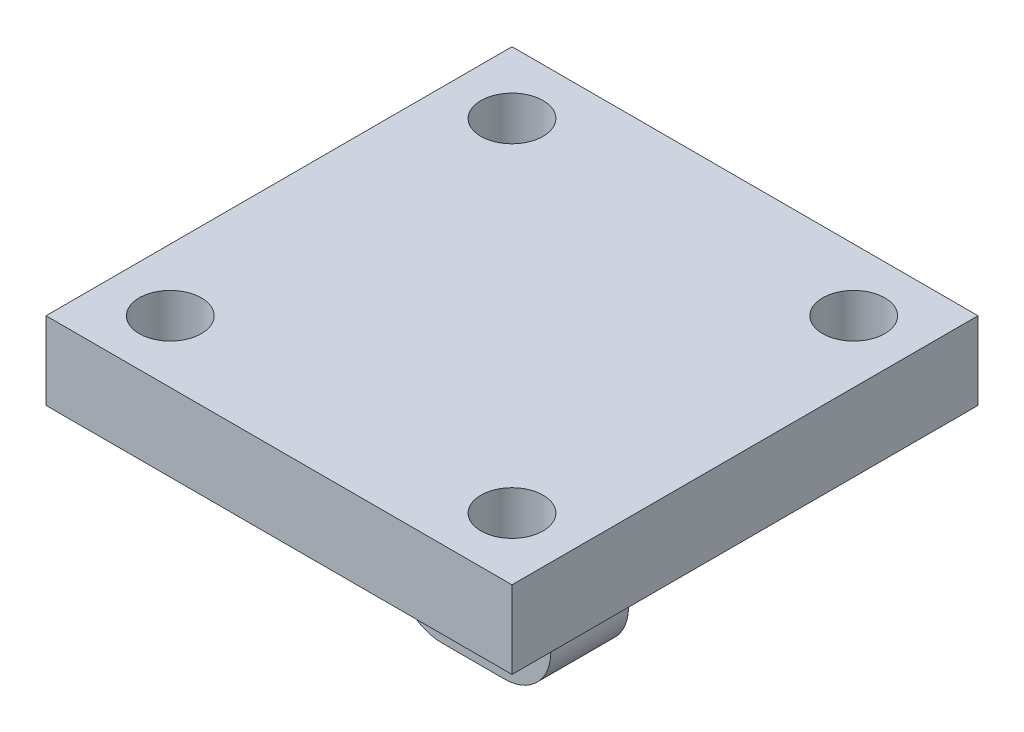
ISO-10303-21;
HEADER;
FILE_DESCRIPTION(('STEP AP214'),'2;1');
FILE_NAME('part.step','',(''),(''),'','','');
FILE_SCHEMA(('AUTOMOTIVE_DESIGN { 1 0 10303 214 1 1 1 1 }'));
ENDSEC;
DATA;
#1=APPLICATION_CONTEXT('core data for automotive mechanical design processes');
#2=APPLICATION_PROTOCOL_DEFINITION('international standard','automotive_design',2000,#1);
#3=PRODUCT_CONTEXT('',#1,'mechanical');
#4=PRODUCT('Part','Part','',(#3));
#5=PRODUCT_RELATED_PRODUCT_CATEGORY('part','',(#4));
#6=PRODUCT_DEFINITION_FORMATION('','',#4);
#7=PRODUCT_DEFINITION_CONTEXT('part definition',#1,'design');
#8=PRODUCT_DEFINITION('design','',#6,#7);
#9=PRODUCT_DEFINITION_SHAPE('','',#8);
#10=(LENGTH_UNIT() NAMED_UNIT(*) SI_UNIT(.MILLI.,.METRE.));
#11=(NAMED_UNIT(*) PLANE_ANGLE_UNIT() SI_UNIT($,.RADIAN.));
#12=(NAMED_UNIT(*) SI_UNIT($,.STERADIAN.) SOLID_ANGLE_UNIT());
#13=UNCERTAINTY_MEASURE_WITH_UNIT(LENGTH_MEASURE(1.E-05),#10,'distance_accuracy_value','');
#14=(GEOMETRIC_REPRESENTATION_CONTEXT(3) GLOBAL_UNCERTAINTY_ASSIGNED_CONTEXT((#13)) GLOBAL_UNIT_ASSIGNED_CONTEXT((#10,
#11,#12)) REPRESENTATION_CONTEXT('',''));
#15=CARTESIAN_POINT('',(0.,0.,0.));
#16=DIRECTION('',(0.,0.,1.));
#17=DIRECTION('',(1.,0.,0.));
#18=AXIS2_PLACEMENT_3D('',#15,#16,#17);
#19=CARTESIAN_POINT('',(-10.,0.,5.));
#20=DIRECTION('',(-1.,0.,0.));
#21=DIRECTION('',(0.,0.,1.));
#22=AXIS2_PLACEMENT_3D('',#19,#20,#21);
#23=PLANE('',#22);
#24=DIRECTION('',(0.,1.,0.));
#25=VECTOR('',#24,1.);
#26=CARTESIAN_POINT('',(-10.,0.,0.));
#27=LINE('',#26,#25);
#28=CARTESIAN_POINT('',(-10.,3.,0.));
#29=VERTEX_POINT('',#28);
#30=CARTESIAN_POINT('',(-10.,8.,0.));
#31=VERTEX_POINT('',#30);
#32=EDGE_CURVE('E208',#29,#31,#27,.T.);
#33=ORIENTED_EDGE('',*,*,#32,.F.);
#34=DIRECTION('',(0.,0.,-1.));
#35=VECTOR('',#34,1.);
#36=CARTESIAN_POINT('',(-10.,3.,5.));
#37=LINE('',#36,#35);
#38=CARTESIAN_POINT('',(-10.,3.,5.));
#39=VERTEX_POINT('',#38);
#40=EDGE_CURVE('E11',#29,#39,#37,.F.);
#41=ORIENTED_EDGE('',*,*,#40,.T.);
#42=DIRECTION('',(0.,1.,0.));
#43=VECTOR('',#42,1.);
#44=CARTESIAN_POINT('',(-10.,0.,5.));
#45=LINE('',#44,#43);
#46=CARTESIAN_POINT('',(-10.,8.,5.));
#47=VERTEX_POINT('',#46);
#48=EDGE_CURVE('E194',#39,#47,#45,.T.);
#49=ORIENTED_EDGE('',*,*,#48,.T.);
#50=DIRECTION('',(0.,0.,1.));
#51=VECTOR('',#50,1.);
#52=CARTESIAN_POINT('',(-10.,8.,0.));
#53=LINE('',#52,#51);
#54=EDGE_CURVE('E227',#47,#31,#53,.F.);
#55=ORIENTED_EDGE('',*,*,#54,.T.);
#56=EDGE_LOOP('',(#33,#41,#49,#55));
#57=FACE_BOUND('',#56,.T.);
#58=ADVANCED_FACE('F38',(#57),#23,.T.);
#59=CARTESIAN_POINT('',(0.,0.,5.));
#60=DIRECTION('',(0.,-1.,0.));
#61=DIRECTION('',(1.,0.,0.));
#62=AXIS2_PLACEMENT_3D('',#59,#60,#61);
#63=PLANE('',#62);
#64=DIRECTION('',(-1.,0.,0.));
#65=VECTOR('',#64,1.);
#66=CARTESIAN_POINT('',(0.,0.,0.));
#67=LINE('',#66,#65);
#68=CARTESIAN_POINT('',(-3.,0.,0.));
#69=VERTEX_POINT('',#68);
#70=CARTESIAN_POINT('',(-7.,0.,0.));
#71=VERTEX_POINT('',#70);
#72=EDGE_CURVE('E211',#69,#71,#67,.T.);
#73=ORIENTED_EDGE('',*,*,#72,.F.);
#74=DIRECTION('',(0.,0.,-1.));
#75=VECTOR('',#74,1.);
#76=CARTESIAN_POINT('',(-3.,0.,5.));
#77=LINE('',#76,#75);
#78=CARTESIAN_POINT('',(-3.,0.,5.));
#79=VERTEX_POINT('',#78);
#80=EDGE_CURVE('E265',#69,#79,#77,.F.);
#81=ORIENTED_EDGE('',*,*,#80,.T.);
#82=DIRECTION('',(-1.,0.,0.));
#83=VECTOR('',#82,1.);
#84=CARTESIAN_POINT('',(0.,0.,5.));
#85=LINE('',#84,#83);
#86=CARTESIAN_POINT('',(-7.,0.,5.));
#87=VERTEX_POINT('',#86);
#88=EDGE_CURVE('E198',#79,#87,#85,.T.);
#89=ORIENTED_EDGE('',*,*,#88,.T.);
#90=DIRECTION('',(0.,0.,-1.));
#91=VECTOR('',#90,1.);
#92=CARTESIAN_POINT('',(-7.,0.,5.));
#93=LINE('',#92,#91);
#94=EDGE_CURVE('E261',#87,#71,#93,.T.);
#95=ORIENTED_EDGE('',*,*,#94,.T.);
#96=EDGE_LOOP('',(#73,#81,#89,#95));
#97=FACE_BOUND('',#96,.T.);
#98=ADVANCED_FACE('F287',(#97),#63,.T.);
#99=CARTESIAN_POINT('',(0.,0.,5.));
#100=DIRECTION('',(-1.,0.,0.));
#101=DIRECTION('',(0.,0.,1.));
#102=AXIS2_PLACEMENT_3D('',#99,#100,#101);
#103=PLANE('',#102);
#104=DIRECTION('',(0.,1.,0.));
#105=VECTOR('',#104,1.);
#106=CARTESIAN_POINT('',(0.,0.,5.));
#107=LINE('',#106,#105);
#108=CARTESIAN_POINT('',(0.,3.,5.));
#109=VERTEX_POINT('',#108);
#110=CARTESIAN_POINT('',(0.,8.,5.));
#111=VERTEX_POINT('',#110);
#112=EDGE_CURVE('E201',#109,#111,#107,.T.);
#113=ORIENTED_EDGE('',*,*,#112,.F.);
#114=DIRECTION('',(0.,0.,-1.));
#115=VECTOR('',#114,1.);
#116=CARTESIAN_POINT('',(0.,3.,0.));
#117=LINE('',#116,#115);
#118=CARTESIAN_POINT('',(0.,3.,0.));
#119=VERTEX_POINT('',#118);
#120=EDGE_CURVE('E251',#109,#119,#117,.T.);
#121=ORIENTED_EDGE('',*,*,#120,.T.);
#122=DIRECTION('',(0.,1.,0.));
#123=VECTOR('',#122,1.);
#124=CARTESIAN_POINT('',(0.,0.,0.));
#125=LINE('',#124,#123);
#126=CARTESIAN_POINT('',(0.,8.,0.));
#127=VERTEX_POINT('',#126);
#128=EDGE_CURVE('E195',#119,#127,#125,.T.);
#129=ORIENTED_EDGE('',*,*,#128,.T.);
#130=DIRECTION('',(0.,0.,1.));
#131=VECTOR('',#130,1.);
#132=CARTESIAN_POINT('',(0.,8.,5.));
#133=LINE('',#132,#131);
#134=EDGE_CURVE('E231',#127,#111,#133,.T.);
#135=ORIENTED_EDGE('',*,*,#134,.T.);
#136=EDGE_LOOP('',(#113,#121,#129,#135));
#137=FACE_BOUND('',#136,.T.);
#138=ADVANCED_FACE('F279',(#137),#103,.F.);
#139=CARTESIAN_POINT('',(-5.,4.24,5.));
#140=DIRECTION('',(0.,0.,-1.));
#141=DIRECTION('',(-1.,0.,0.));
#142=AXIS2_PLACEMENT_3D('',#139,#140,#141);
#143=CYLINDRICAL_SURFACE('',#142,2.);
#144=CARTESIAN_POINT('',(-5.,4.24,5.));
#145=DIRECTION('',(0.,0.,1.));
#146=DIRECTION('',(1.,0.,0.));
#147=AXIS2_PLACEMENT_3D('',#144,#145,#146);
#148=CIRCLE('',#147,2.);
#149=CARTESIAN_POINT('',(-3.,4.24,5.));
#150=VERTEX_POINT('',#149);
#151=EDGE_CURVE('E190',#150,#150,#148,.T.);
#152=ORIENTED_EDGE('',*,*,#151,.T.);
#153=EDGE_LOOP('',(#152));
#154=FACE_BOUND('',#153,.T.);
#155=CARTESIAN_POINT('',(-5.,4.24,0.));
#156=DIRECTION('',(0.,0.,1.));
#157=DIRECTION('',(1.,0.,0.));
#158=AXIS2_PLACEMENT_3D('',#155,#156,#157);
#159=CIRCLE('',#158,2.);
#160=CARTESIAN_POINT('',(-3.,4.24,0.));
#161=VERTEX_POINT('',#160);
#162=EDGE_CURVE('E189',#161,#161,#159,.T.);
#163=ORIENTED_EDGE('',*,*,#162,.F.);
#164=EDGE_LOOP('',(#163));
#165=FACE_BOUND('',#164,.T.);
#166=ADVANCED_FACE('F317',(#154,#165),#143,.F.);
#167=CARTESIAN_POINT('',(0.,0.,5.));
#168=DIRECTION('',(0.,0.,1.));
#169=DIRECTION('',(1.,0.,0.));
#170=AXIS2_PLACEMENT_3D('',#167,#168,#169);
#171=PLANE('',#170);
#172=ORIENTED_EDGE('',*,*,#88,.F.);
#173=CARTESIAN_POINT('',(-3.,3.,5.));
#174=DIRECTION('',(0.,0.,1.));
#175=DIRECTION('',(1.,0.,0.));
#176=AXIS2_PLACEMENT_3D('',#173,#174,#175);
#177=CIRCLE('',#176,3.);
#178=EDGE_CURVE('E47',#79,#109,#177,.T.);
#179=ORIENTED_EDGE('',*,*,#178,.T.);
#180=ORIENTED_EDGE('',*,*,#112,.T.);
#181=CARTESIAN_POINT('',(5.,8.,5.));
#182=DIRECTION('',(0.,0.,1.));
#183=DIRECTION('',(1.,0.,0.));
#184=AXIS2_PLACEMENT_3D('',#181,#182,#183);
#185=CIRCLE('',#184,5.);
#186=CARTESIAN_POINT('',(5.,13.,5.));
#187=VERTEX_POINT('',#186);
#188=EDGE_CURVE('E243',#111,#187,#185,.F.);
#189=ORIENTED_EDGE('',*,*,#188,.T.);
#190=DIRECTION('',(1.,0.,0.));
#191=VECTOR('',#190,1.);
#192=CARTESIAN_POINT('',(0.,13.,5.));
#193=LINE('',#192,#191);
#194=CARTESIAN_POINT('',(-15.,13.,5.));
#195=VERTEX_POINT('',#194);
#196=EDGE_CURVE('E181',#195,#187,#193,.T.);
#197=ORIENTED_EDGE('',*,*,#196,.F.);
#198=CARTESIAN_POINT('',(-15.,8.,5.));
#199=DIRECTION('',(0.,0.,1.));
#200=DIRECTION('',(1.,0.,0.));
#201=AXIS2_PLACEMENT_3D('',#198,#199,#200);
#202=CIRCLE('',#201,5.);
#203=EDGE_CURVE('E235',#195,#47,#202,.F.);
#204=ORIENTED_EDGE('',*,*,#203,.T.);
#205=ORIENTED_EDGE('',*,*,#48,.F.);
#206=CARTESIAN_POINT('',(-7.,3.,5.));
#207=DIRECTION('',(0.,0.,1.));
#208=DIRECTION('',(1.,0.,0.));
#209=AXIS2_PLACEMENT_3D('',#206,#207,#208);
#210=CIRCLE('',#209,3.);
#211=EDGE_CURVE('E59',#39,#87,#210,.T.);
#212=ORIENTED_EDGE('',*,*,#211,.T.);
#213=EDGE_LOOP('',(#172,#179,#180,#189,#197,#204,#205,#212));
#214=FACE_BOUND('',#213,.T.);
#215=ORIENTED_EDGE('',*,*,#151,.F.);
#216=EDGE_LOOP('',(#215));
#217=FACE_BOUND('',#216,.T.);
#218=ADVANCED_FACE('F272',(#214,#217),#171,.T.);
#219=CARTESIAN_POINT('',(0.,0.,0.));
#220=DIRECTION('',(0.,0.,1.));
#221=DIRECTION('',(1.,0.,0.));
#222=AXIS2_PLACEMENT_3D('',#219,#220,#221);
#223=PLANE('',#222);
#224=ORIENTED_EDGE('',*,*,#162,.T.);
#225=EDGE_LOOP('',(#224));
#226=FACE_BOUND('',#225,.T.);
#227=ORIENTED_EDGE('',*,*,#128,.F.);
#228=CARTESIAN_POINT('',(-3.,3.,0.));
#229=DIRECTION('',(0.,0.,1.));
#230=DIRECTION('',(1.,0.,0.));
#231=AXIS2_PLACEMENT_3D('',#228,#229,#230);
#232=CIRCLE('',#231,3.);
#233=EDGE_CURVE('E258',#119,#69,#232,.F.);
#234=ORIENTED_EDGE('',*,*,#233,.T.);
#235=ORIENTED_EDGE('',*,*,#72,.T.);
#236=CARTESIAN_POINT('',(-7.,3.,0.));
#237=DIRECTION('',(0.,0.,1.));
#238=DIRECTION('',(1.,0.,0.));
#239=AXIS2_PLACEMENT_3D('',#236,#237,#238);
#240=CIRCLE('',#239,3.);
#241=EDGE_CURVE('E255',#71,#29,#240,.F.);
#242=ORIENTED_EDGE('',*,*,#241,.T.);
#243=ORIENTED_EDGE('',*,*,#32,.T.);
#244=CARTESIAN_POINT('',(-15.,8.,0.));
#245=DIRECTION('',(0.,0.,1.));
#246=DIRECTION('',(1.,0.,0.));
#247=AXIS2_PLACEMENT_3D('',#244,#245,#246);
#248=CIRCLE('',#247,5.);
#249=CARTESIAN_POINT('',(-15.,13.,0.));
#250=VERTEX_POINT('',#249);
#251=EDGE_CURVE('E239',#31,#250,#248,.T.);
#252=ORIENTED_EDGE('',*,*,#251,.T.);
#253=DIRECTION('',(1.,0.,0.));
#254=VECTOR('',#253,1.);
#255=CARTESIAN_POINT('',(0.,13.,0.));
#256=LINE('',#255,#254);
#257=CARTESIAN_POINT('',(5.,13.,0.));
#258=VERTEX_POINT('',#257);
#259=EDGE_CURVE('E204',#250,#258,#256,.T.);
#260=ORIENTED_EDGE('',*,*,#259,.T.);
#261=CARTESIAN_POINT('',(5.,8.,0.));
#262=DIRECTION('',(0.,0.,1.));
#263=DIRECTION('',(1.,0.,0.));
#264=AXIS2_PLACEMENT_3D('',#261,#262,#263);
#265=CIRCLE('',#264,5.);
#266=EDGE_CURVE('E247',#258,#127,#265,.T.);
#267=ORIENTED_EDGE('',*,*,#266,.T.);
#268=EDGE_LOOP('',(#227,#234,#235,#242,#243,#252,#260,#267));
#269=FACE_BOUND('',#268,.T.);
#270=ADVANCED_FACE('F285',(#226,#269),#223,.F.);
#271=CARTESIAN_POINT('',(-20.,13.,17.5));
#272=DIRECTION('',(-1.,0.,0.));
#273=DIRECTION('',(0.,0.,1.));
#274=AXIS2_PLACEMENT_3D('',#271,#272,#273);
#275=PLANE('',#274);
#276=DIRECTION('',(0.,0.,1.));
#277=VECTOR('',#276,1.);
#278=CARTESIAN_POINT('',(-20.,18.,17.5));
#279=LINE('',#278,#277);
#280=CARTESIAN_POINT('',(-20.,18.,-12.5));
#281=VERTEX_POINT('',#280);
#282=CARTESIAN_POINT('',(-20.,18.,17.5));
#283=VERTEX_POINT('',#282);
#284=EDGE_CURVE('E170',#281,#283,#279,.T.);
#285=ORIENTED_EDGE('',*,*,#284,.F.);
#286=DIRECTION('',(0.,1.,0.));
#287=VECTOR('',#286,1.);
#288=CARTESIAN_POINT('',(-20.,13.,-12.5));
#289=LINE('',#288,#287);
#290=CARTESIAN_POINT('',(-20.,13.,-12.5));
#291=VERTEX_POINT('',#290);
#292=EDGE_CURVE('E154',#291,#281,#289,.T.);
#293=ORIENTED_EDGE('',*,*,#292,.F.);
#294=DIRECTION('',(0.,0.,1.));
#295=VECTOR('',#294,1.);
#296=CARTESIAN_POINT('',(-20.,13.,17.5));
#297=LINE('',#296,#295);
#298=CARTESIAN_POINT('',(-20.,13.,17.5));
#299=VERTEX_POINT('',#298);
#300=EDGE_CURVE('E147',#291,#299,#297,.T.);
#301=ORIENTED_EDGE('',*,*,#300,.T.);
#302=DIRECTION('',(0.,1.,0.));
#303=VECTOR('',#302,1.);
#304=CARTESIAN_POINT('',(-20.,13.,17.5));
#305=LINE('',#304,#303);
#306=EDGE_CURVE('E128',#299,#283,#305,.T.);
#307=ORIENTED_EDGE('',*,*,#306,.T.);
#308=EDGE_LOOP('',(#285,#293,#301,#307));
#309=FACE_BOUND('',#308,.T.);
#310=ADVANCED_FACE('F153',(#309),#275,.T.);
#311=CARTESIAN_POINT('',(-20.,13.,-12.5));
#312=DIRECTION('',(0.,0.,-1.));
#313=DIRECTION('',(-1.,0.,0.));
#314=AXIS2_PLACEMENT_3D('',#311,#312,#313);
#315=PLANE('',#314);
#316=DIRECTION('',(-1.,0.,0.));
#317=VECTOR('',#316,1.);
#318=CARTESIAN_POINT('',(-20.,18.,-12.5));
#319=LINE('',#318,#317);
#320=CARTESIAN_POINT('',(10.,18.,-12.5));
#321=VERTEX_POINT('',#320);
#322=EDGE_CURVE('E156',#321,#281,#319,.T.);
#323=ORIENTED_EDGE('',*,*,#322,.F.);
#324=DIRECTION('',(0.,1.,0.));
#325=VECTOR('',#324,1.);
#326=CARTESIAN_POINT('',(10.,13.,-12.5));
#327=LINE('',#326,#325);
#328=CARTESIAN_POINT('',(10.,13.,-12.5));
#329=VERTEX_POINT('',#328);
#330=EDGE_CURVE('E182',#329,#321,#327,.T.);
#331=ORIENTED_EDGE('',*,*,#330,.F.);
#332=DIRECTION('',(-1.,0.,0.));
#333=VECTOR('',#332,1.);
#334=CARTESIAN_POINT('',(-20.,13.,-12.5));
#335=LINE('',#334,#333);
#336=EDGE_CURVE('E140',#329,#291,#335,.T.);
#337=ORIENTED_EDGE('',*,*,#336,.T.);
#338=ORIENTED_EDGE('',*,*,#292,.T.);
#339=EDGE_LOOP('',(#323,#331,#337,#338));
#340=FACE_BOUND('',#339,.T.);
#341=ADVANCED_FACE('F334',(#340),#315,.T.);
#342=CARTESIAN_POINT('',(10.,13.,17.5));
#343=DIRECTION('',(1.,0.,0.));
#344=DIRECTION('',(0.,0.,-1.));
#345=AXIS2_PLACEMENT_3D('',#342,#343,#344);
#346=PLANE('',#345);
#347=DIRECTION('',(0.,0.,-1.));
#348=VECTOR('',#347,1.);
#349=CARTESIAN_POINT('',(10.,18.,17.5));
#350=LINE('',#349,#348);
#351=CARTESIAN_POINT('',(10.,18.,17.5));
#352=VERTEX_POINT('',#351);
#353=EDGE_CURVE('E160',#352,#321,#350,.T.);
#354=ORIENTED_EDGE('',*,*,#353,.F.);
#355=DIRECTION('',(0.,1.,0.));
#356=VECTOR('',#355,1.);
#357=CARTESIAN_POINT('',(10.,13.,17.5));
#358=LINE('',#357,#356);
#359=CARTESIAN_POINT('',(10.,13.,17.5));
#360=VERTEX_POINT('',#359);
#361=EDGE_CURVE('E139',#360,#352,#358,.T.);
#362=ORIENTED_EDGE('',*,*,#361,.F.);
#363=DIRECTION('',(0.,0.,-1.));
#364=VECTOR('',#363,1.);
#365=CARTESIAN_POINT('',(10.,13.,17.5));
#366=LINE('',#365,#364);
#367=EDGE_CURVE('E150',#360,#329,#366,.T.);
#368=ORIENTED_EDGE('',*,*,#367,.T.);
#369=ORIENTED_EDGE('',*,*,#330,.T.);
#370=EDGE_LOOP('',(#354,#362,#368,#369));
#371=FACE_BOUND('',#370,.T.);
#372=ADVANCED_FACE('F364',(#371),#346,.T.);
#373=CARTESIAN_POINT('',(-20.,13.,17.5));
#374=DIRECTION('',(0.,0.,1.));
#375=DIRECTION('',(1.,0.,0.));
#376=AXIS2_PLACEMENT_3D('',#373,#374,#375);
#377=PLANE('',#376);
#378=DIRECTION('',(1.,0.,0.));
#379=VECTOR('',#378,1.);
#380=CARTESIAN_POINT('',(-20.,18.,17.5));
#381=LINE('',#380,#379);
#382=EDGE_CURVE('E133',#283,#352,#381,.T.);
#383=ORIENTED_EDGE('',*,*,#382,.F.);
#384=ORIENTED_EDGE('',*,*,#306,.F.);
#385=DIRECTION('',(1.,0.,0.));
#386=VECTOR('',#385,1.);
#387=CARTESIAN_POINT('',(-20.,13.,17.5));
#388=LINE('',#387,#386);
#389=EDGE_CURVE('E131',#299,#360,#388,.T.);
#390=ORIENTED_EDGE('',*,*,#389,.T.);
#391=ORIENTED_EDGE('',*,*,#361,.T.);
#392=EDGE_LOOP('',(#383,#384,#390,#391));
#393=FACE_BOUND('',#392,.T.);
#394=ADVANCED_FACE('F130',(#393),#377,.T.);
#395=CARTESIAN_POINT('',(0.,13.,0.));
#396=DIRECTION('',(0.,-1.,0.));
#397=DIRECTION('',(0.,0.,-1.));
#398=AXIS2_PLACEMENT_3D('',#395,#396,#397);
#399=PLANE('',#398);
#400=CARTESIAN_POINT('',(-16.,13.,13.5));
#401=DIRECTION('',(0.,1.,0.));
#402=DIRECTION('',(0.,0.,1.));
#403=AXIS2_PLACEMENT_3D('',#400,#401,#402);
#404=CIRCLE('',#403,2.);
#405=CARTESIAN_POINT('',(-16.,13.,15.5));
#406=VERTEX_POINT('',#405);
#407=EDGE_CURVE('E406',#406,#406,#404,.T.);
#408=ORIENTED_EDGE('',*,*,#407,.T.);
#409=EDGE_LOOP('',(#408));
#410=FACE_BOUND('',#409,.T.);
#411=CARTESIAN_POINT('',(6.,13.,13.5));
#412=DIRECTION('',(0.,1.,0.));
#413=DIRECTION('',(0.,0.,1.));
#414=AXIS2_PLACEMENT_3D('',#411,#412,#413);
#415=CIRCLE('',#414,2.);
#416=CARTESIAN_POINT('',(6.,13.,15.5));
#417=VERTEX_POINT('',#416);
#418=EDGE_CURVE('E396',#417,#417,#415,.T.);
#419=ORIENTED_EDGE('',*,*,#418,.T.);
#420=EDGE_LOOP('',(#419));
#421=FACE_BOUND('',#420,.T.);
#422=CARTESIAN_POINT('',(6.,13.,-8.5));
#423=DIRECTION('',(0.,1.,0.));
#424=DIRECTION('',(0.,0.,1.));
#425=AXIS2_PLACEMENT_3D('',#422,#423,#424);
#426=CIRCLE('',#425,2.);
#427=CARTESIAN_POINT('',(6.,13.,-6.5));
#428=VERTEX_POINT('',#427);
#429=EDGE_CURVE('E394',#428,#428,#426,.T.);
#430=ORIENTED_EDGE('',*,*,#429,.T.);
#431=EDGE_LOOP('',(#430));
#432=FACE_BOUND('',#431,.T.);
#433=CARTESIAN_POINT('',(-16.,13.,-8.5));
#434=DIRECTION('',(0.,1.,0.));
#435=DIRECTION('',(0.,0.,1.));
#436=AXIS2_PLACEMENT_3D('',#433,#434,#435);
#437=CIRCLE('',#436,2.);
#438=CARTESIAN_POINT('',(-16.,13.,-6.5));
#439=VERTEX_POINT('',#438);
#440=EDGE_CURVE('E173',#439,#439,#437,.T.);
#441=ORIENTED_EDGE('',*,*,#440,.T.);
#442=EDGE_LOOP('',(#441));
#443=FACE_BOUND('',#442,.T.);
#444=DIRECTION('',(0.,0.,1.));
#445=VECTOR('',#444,1.);
#446=CARTESIAN_POINT('',(-15.,13.,5.));
#447=LINE('',#446,#445);
#448=EDGE_CURVE('E223',#250,#195,#447,.T.);
#449=ORIENTED_EDGE('',*,*,#448,.T.);
#450=ORIENTED_EDGE('',*,*,#196,.T.);
#451=DIRECTION('',(0.,0.,1.));
#452=VECTOR('',#451,1.);
#453=CARTESIAN_POINT('',(5.,13.,0.));
#454=LINE('',#453,#452);
#455=EDGE_CURVE('E219',#187,#258,#454,.F.);
#456=ORIENTED_EDGE('',*,*,#455,.T.);
#457=ORIENTED_EDGE('',*,*,#259,.F.);
#458=EDGE_LOOP('',(#449,#450,#456,#457));
#459=FACE_BOUND('',#458,.T.);
#460=ORIENTED_EDGE('',*,*,#300,.F.);
#461=ORIENTED_EDGE('',*,*,#336,.F.);
#462=ORIENTED_EDGE('',*,*,#367,.F.);
#463=ORIENTED_EDGE('',*,*,#389,.F.);
#464=EDGE_LOOP('',(#460,#461,#462,#463));
#465=FACE_BOUND('',#464,.T.);
#466=ADVANCED_FACE('F145',(#410,#421,#432,#443,#459,#465),#399,.T.);
#467=CARTESIAN_POINT('',(0.,18.,5.));
#468=DIRECTION('',(0.,-1.,0.));
#469=DIRECTION('',(0.,0.,-1.));
#470=AXIS2_PLACEMENT_3D('',#467,#468,#469);
#471=PLANE('',#470);
#472=CARTESIAN_POINT('',(-16.,18.,13.5));
#473=DIRECTION('',(0.,1.,0.));
#474=DIRECTION('',(0.,0.,1.));
#475=AXIS2_PLACEMENT_3D('',#472,#473,#474);
#476=CIRCLE('',#475,2.);
#477=CARTESIAN_POINT('',(-16.,18.,15.5));
#478=VERTEX_POINT('',#477);
#479=EDGE_CURVE('E348',#478,#478,#476,.T.);
#480=ORIENTED_EDGE('',*,*,#479,.F.);
#481=EDGE_LOOP('',(#480));
#482=FACE_BOUND('',#481,.T.);
#483=CARTESIAN_POINT('',(6.,18.,13.5));
#484=DIRECTION('',(0.,1.,0.));
#485=DIRECTION('',(0.,0.,1.));
#486=AXIS2_PLACEMENT_3D('',#483,#484,#485);
#487=CIRCLE('',#486,2.);
#488=CARTESIAN_POINT('',(6.,18.,15.5));
#489=VERTEX_POINT('',#488);
#490=EDGE_CURVE('E352',#489,#489,#487,.T.);
#491=ORIENTED_EDGE('',*,*,#490,.F.);
#492=EDGE_LOOP('',(#491));
#493=FACE_BOUND('',#492,.T.);
#494=CARTESIAN_POINT('',(6.,18.,-8.5));
#495=DIRECTION('',(0.,1.,0.));
#496=DIRECTION('',(0.,0.,1.));
#497=AXIS2_PLACEMENT_3D('',#494,#495,#496);
#498=CIRCLE('',#497,2.);
#499=CARTESIAN_POINT('',(6.,18.,-6.5));
#500=VERTEX_POINT('',#499);
#501=EDGE_CURVE('E356',#500,#500,#498,.T.);
#502=ORIENTED_EDGE('',*,*,#501,.F.);
#503=EDGE_LOOP('',(#502));
#504=FACE_BOUND('',#503,.T.);
#505=CARTESIAN_POINT('',(-16.,18.,-8.5));
#506=DIRECTION('',(0.,1.,0.));
#507=DIRECTION('',(0.,0.,1.));
#508=AXIS2_PLACEMENT_3D('',#505,#506,#507);
#509=CIRCLE('',#508,2.);
#510=CARTESIAN_POINT('',(-16.,18.,-6.5));
#511=VERTEX_POINT('',#510);
#512=EDGE_CURVE('E163',#511,#511,#509,.T.);
#513=ORIENTED_EDGE('',*,*,#512,.F.);
#514=EDGE_LOOP('',(#513));
#515=FACE_BOUND('',#514,.T.);
#516=ORIENTED_EDGE('',*,*,#284,.T.);
#517=ORIENTED_EDGE('',*,*,#382,.T.);
#518=ORIENTED_EDGE('',*,*,#353,.T.);
#519=ORIENTED_EDGE('',*,*,#322,.T.);
#520=EDGE_LOOP('',(#516,#517,#518,#519));
#521=FACE_BOUND('',#520,.T.);
#522=ADVANCED_FACE('F307',(#482,#493,#504,#515,#521),#471,.F.);
#523=CARTESIAN_POINT('',(-15.,8.,0.));
#524=DIRECTION('',(0.,0.,-1.));
#525=DIRECTION('',(-1.,0.,0.));
#526=AXIS2_PLACEMENT_3D('',#523,#524,#525);
#527=CYLINDRICAL_SURFACE('',#526,5.);
#528=ORIENTED_EDGE('',*,*,#251,.F.);
#529=ORIENTED_EDGE('',*,*,#54,.F.);
#530=ORIENTED_EDGE('',*,*,#203,.F.);
#531=ORIENTED_EDGE('',*,*,#448,.F.);
#532=EDGE_LOOP('',(#528,#529,#530,#531));
#533=FACE_BOUND('',#532,.T.);
#534=ADVANCED_FACE('F295',(#533),#527,.F.);
#535=CARTESIAN_POINT('',(5.,8.,5.));
#536=DIRECTION('',(0.,0.,1.));
#537=DIRECTION('',(1.,0.,0.));
#538=AXIS2_PLACEMENT_3D('',#535,#536,#537);
#539=CYLINDRICAL_SURFACE('',#538,5.);
#540=ORIENTED_EDGE('',*,*,#266,.F.);
#541=ORIENTED_EDGE('',*,*,#455,.F.);
#542=ORIENTED_EDGE('',*,*,#188,.F.);
#543=ORIENTED_EDGE('',*,*,#134,.F.);
#544=EDGE_LOOP('',(#540,#541,#542,#543));
#545=FACE_BOUND('',#544,.T.);
#546=ADVANCED_FACE('F300',(#545),#539,.F.);
#547=CARTESIAN_POINT('',(-3.,3.,5.));
#548=DIRECTION('',(0.,0.,1.));
#549=DIRECTION('',(1.,0.,0.));
#550=AXIS2_PLACEMENT_3D('',#547,#548,#549);
#551=CYLINDRICAL_SURFACE('',#550,3.);
#552=ORIENTED_EDGE('',*,*,#178,.F.);
#553=ORIENTED_EDGE('',*,*,#80,.F.);
#554=ORIENTED_EDGE('',*,*,#233,.F.);
#555=ORIENTED_EDGE('',*,*,#120,.F.);
#556=EDGE_LOOP('',(#552,#553,#554,#555));
#557=FACE_BOUND('',#556,.T.);
#558=ADVANCED_FACE('F282',(#557),#551,.T.);
#559=CARTESIAN_POINT('',(-7.,3.,5.));
#560=DIRECTION('',(0.,0.,-1.));
#561=DIRECTION('',(-1.,0.,0.));
#562=AXIS2_PLACEMENT_3D('',#559,#560,#561);
#563=CYLINDRICAL_SURFACE('',#562,3.);
#564=ORIENTED_EDGE('',*,*,#211,.F.);
#565=ORIENTED_EDGE('',*,*,#40,.F.);
#566=ORIENTED_EDGE('',*,*,#241,.F.);
#567=ORIENTED_EDGE('',*,*,#94,.F.);
#568=EDGE_LOOP('',(#564,#565,#566,#567));
#569=FACE_BOUND('',#568,.T.);
#570=ADVANCED_FACE('F40',(#569),#563,.T.);
#571=CARTESIAN_POINT('',(-16.,13.,-8.5));
#572=DIRECTION('',(0.,1.,0.));
#573=DIRECTION('',(0.,0.,1.));
#574=AXIS2_PLACEMENT_3D('',#571,#572,#573);
#575=CYLINDRICAL_SURFACE('',#574,2.);
#576=ORIENTED_EDGE('',*,*,#440,.F.);
#577=EDGE_LOOP('',(#576));
#578=FACE_BOUND('',#577,.T.);
#579=ORIENTED_EDGE('',*,*,#512,.T.);
#580=EDGE_LOOP('',(#579));
#581=FACE_BOUND('',#580,.T.);
#582=ADVANCED_FACE('F374',(#578,#581),#575,.F.);
#583=CARTESIAN_POINT('',(6.,13.,-8.5));
#584=DIRECTION('',(0.,1.,0.));
#585=DIRECTION('',(0.,0.,1.));
#586=AXIS2_PLACEMENT_3D('',#583,#584,#585);
#587=CYLINDRICAL_SURFACE('',#586,2.);
#588=ORIENTED_EDGE('',*,*,#429,.F.);
#589=EDGE_LOOP('',(#588));
#590=FACE_BOUND('',#589,.T.);
#591=ORIENTED_EDGE('',*,*,#501,.T.);
#592=EDGE_LOOP('',(#591));
#593=FACE_BOUND('',#592,.T.);
#594=ADVANCED_FACE('F377',(#590,#593),#587,.F.);
#595=CARTESIAN_POINT('',(6.,13.,13.5));
#596=DIRECTION('',(0.,1.,0.));
#597=DIRECTION('',(0.,0.,1.));
#598=AXIS2_PLACEMENT_3D('',#595,#596,#597);
#599=CYLINDRICAL_SURFACE('',#598,2.);
#600=ORIENTED_EDGE('',*,*,#418,.F.);
#601=EDGE_LOOP('',(#600));
#602=FACE_BOUND('',#601,.T.);
#603=ORIENTED_EDGE('',*,*,#490,.T.);
#604=EDGE_LOOP('',(#603));
#605=FACE_BOUND('',#604,.T.);
#606=ADVANCED_FACE('F382',(#602,#605),#599,.F.);
#607=CARTESIAN_POINT('',(-16.,13.,13.5));
#608=DIRECTION('',(0.,1.,0.));
#609=DIRECTION('',(0.,0.,1.));
#610=AXIS2_PLACEMENT_3D('',#607,#608,#609);
#611=CYLINDRICAL_SURFACE('',#610,2.);
#612=ORIENTED_EDGE('',*,*,#407,.F.);
#613=EDGE_LOOP('',(#612));
#614=FACE_BOUND('',#613,.T.);
#615=ORIENTED_EDGE('',*,*,#479,.T.);
#616=EDGE_LOOP('',(#615));
#617=FACE_BOUND('',#616,.T.);
#618=ADVANCED_FACE('F379',(#614,#617),#611,.F.);
#619=CLOSED_SHELL('',(#58,#98,#138,#166,#218,#270,#310,#341,#372,#394,#466,#522,#534,#546,#558,
#570,#582,#594,#606,#618));
#620=MANIFOLD_SOLID_BREP('B2',#619);
#621=ADVANCED_BREP_SHAPE_REPRESENTATION('',(#18,#620),#14);
#622=SHAPE_DEFINITION_REPRESENTATION(#9,#621);
ENDSEC;
END-ISO-10303-21;
